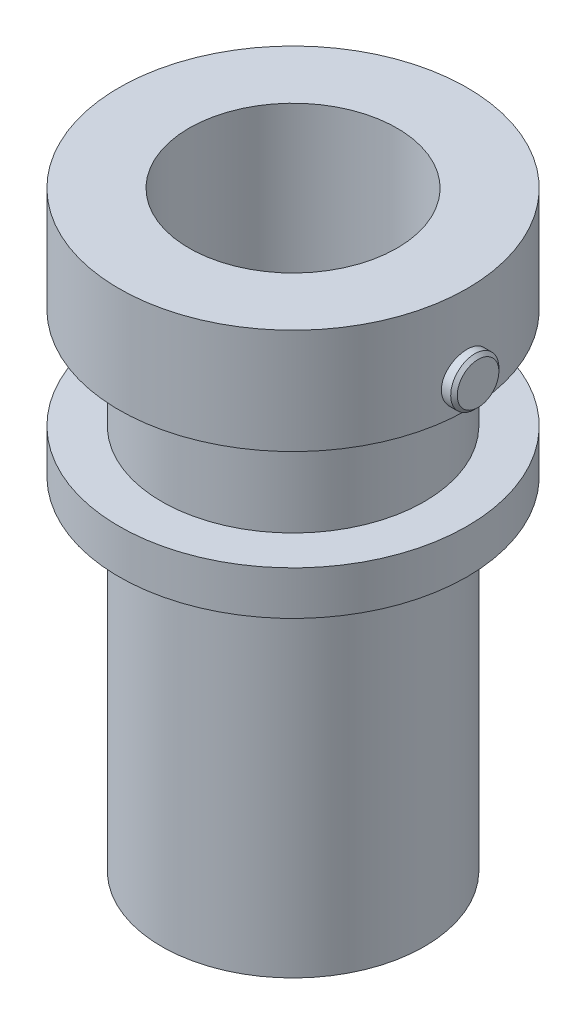
ISO-10303-21;
HEADER;
FILE_DESCRIPTION(('STEP AP214'),'2;1');
FILE_NAME('part.step','',(''),(''),'','','');
FILE_SCHEMA(('AUTOMOTIVE_DESIGN { 1 0 10303 214 1 1 1 1 }'));
ENDSEC;
DATA;
#1=APPLICATION_CONTEXT('core data for automotive mechanical design processes');
#2=APPLICATION_PROTOCOL_DEFINITION('international standard','automotive_design',2000,#1);
#3=PRODUCT_CONTEXT('',#1,'mechanical');
#4=PRODUCT('Part','Part','',(#3));
#5=PRODUCT_RELATED_PRODUCT_CATEGORY('part','',(#4));
#6=PRODUCT_DEFINITION_FORMATION('','',#4);
#7=PRODUCT_DEFINITION_CONTEXT('part definition',#1,'design');
#8=PRODUCT_DEFINITION('design','',#6,#7);
#9=PRODUCT_DEFINITION_SHAPE('','',#8);
#10=(LENGTH_UNIT() NAMED_UNIT(*) SI_UNIT(.MILLI.,.METRE.));
#11=(NAMED_UNIT(*) PLANE_ANGLE_UNIT() SI_UNIT($,.RADIAN.));
#12=(NAMED_UNIT(*) SI_UNIT($,.STERADIAN.) SOLID_ANGLE_UNIT());
#13=UNCERTAINTY_MEASURE_WITH_UNIT(LENGTH_MEASURE(1.E-05),#10,'distance_accuracy_value','');
#14=(GEOMETRIC_REPRESENTATION_CONTEXT(3) GLOBAL_UNCERTAINTY_ASSIGNED_CONTEXT((#13)) GLOBAL_UNIT_ASSIGNED_CONTEXT((#10,
#11,#12)) REPRESENTATION_CONTEXT('',''));
#15=CARTESIAN_POINT('',(0.,0.,0.));
#16=DIRECTION('',(0.,0.,1.));
#17=DIRECTION('',(1.,0.,0.));
#18=AXIS2_PLACEMENT_3D('',#15,#16,#17);
#19=CARTESIAN_POINT('',(0.,-28.35,0.));
#20=DIRECTION('',(0.,1.,0.));
#21=DIRECTION('',(1.,0.,0.));
#22=AXIS2_PLACEMENT_3D('',#19,#20,#21);
#23=CYLINDRICAL_SURFACE('',#22,4.75);
#24=CARTESIAN_POINT('',(0.,-14.5,0.));
#25=DIRECTION('',(0.,1.,0.));
#26=DIRECTION('',(1.,0.,0.));
#27=AXIS2_PLACEMENT_3D('',#24,#25,#26);
#28=CIRCLE('',#27,4.75);
#29=CARTESIAN_POINT('',(4.75,-14.5,0.));
#30=VERTEX_POINT('',#29);
#31=EDGE_CURVE('E35',#30,#30,#28,.T.);
#32=ORIENTED_EDGE('',*,*,#31,.F.);
#33=EDGE_LOOP('',(#32));
#34=FACE_BOUND('',#33,.T.);
#35=CARTESIAN_POINT('',(0.,0.,0.));
#36=DIRECTION('',(0.,1.,0.));
#37=DIRECTION('',(1.,0.,0.));
#38=AXIS2_PLACEMENT_3D('',#35,#36,#37);
#39=CIRCLE('',#38,4.75);
#40=CARTESIAN_POINT('',(4.75,0.,0.));
#41=VERTEX_POINT('',#40);
#42=EDGE_CURVE('E10',#41,#41,#39,.T.);
#43=ORIENTED_EDGE('',*,*,#42,.T.);
#44=EDGE_LOOP('',(#43));
#45=FACE_BOUND('',#44,.T.);
#46=ADVANCED_FACE('F15',(#34,#45),#23,.F.);
#47=CARTESIAN_POINT('',(0.,0.,0.));
#48=DIRECTION('',(0.,1.,0.));
#49=DIRECTION('',(1.,0.,0.));
#50=AXIS2_PLACEMENT_3D('',#47,#48,#49);
#51=PLANE('',#50);
#52=CARTESIAN_POINT('',(0.,0.,0.));
#53=DIRECTION('',(0.,-1.,0.));
#54=DIRECTION('',(1.,0.,0.));
#55=AXIS2_PLACEMENT_3D('',#52,#53,#54);
#56=CIRCLE('',#55,7.95);
#57=CARTESIAN_POINT('',(7.95,0.,0.));
#58=VERTEX_POINT('',#57);
#59=EDGE_CURVE('E40',#58,#58,#56,.T.);
#60=ORIENTED_EDGE('',*,*,#59,.F.);
#61=EDGE_LOOP('',(#60));
#62=FACE_BOUND('',#61,.T.);
#63=ORIENTED_EDGE('',*,*,#42,.F.);
#64=EDGE_LOOP('',(#63));
#65=FACE_BOUND('',#64,.T.);
#66=ADVANCED_FACE('F153',(#62,#65),#51,.T.);
#67=CARTESIAN_POINT('',(0.,-28.35,0.));
#68=DIRECTION('',(0.,1.,0.));
#69=DIRECTION('',(1.,0.,0.));
#70=AXIS2_PLACEMENT_3D('',#67,#68,#69);
#71=CYLINDRICAL_SURFACE('',#70,7.95);
#72=ORIENTED_EDGE('',*,*,#59,.T.);
#73=EDGE_LOOP('',(#72));
#74=FACE_BOUND('',#73,.T.);
#75=CARTESIAN_POINT('',(7.95,-4.6,0.));
#76=CARTESIAN_POINT('',(7.94999904250905,-4.59999725817584,-0.0614151600537309));
#77=CARTESIAN_POINT('',(7.94928027401464,-4.59483508264812,-0.12291016262668));
#78=CARTESIAN_POINT('',(7.94648045014473,-4.57431428580731,-0.24422885644809));
#79=CARTESIAN_POINT('',(7.94439658195358,-4.55893461019969,-0.304048830303224));
#80=CARTESIAN_POINT('',(7.93910096661117,-4.51844219252123,-0.420178778865689));
#81=CARTESIAN_POINT('',(7.93589048356949,-4.49334035586676,-0.4764926045802));
#82=CARTESIAN_POINT('',(7.9286983475142,-4.43413954868757,-0.584083284756709));
#83=CARTESIAN_POINT('',(7.92471700556632,-4.40004420532053,-0.635362158442217));
#84=CARTESIAN_POINT('',(7.91639594017454,-4.32357389716322,-0.731803073256726));
#85=CARTESIAN_POINT('',(7.91205418572243,-4.28114987233136,-0.77692604530919));
#86=CARTESIAN_POINT('',(7.90351761024574,-4.1893300589061,-0.859438453178167));
#87=CARTESIAN_POINT('',(7.89932280462818,-4.13993354198838,-0.896827080082414));
#88=CARTESIAN_POINT('',(7.89153592555042,-4.03531938629598,-0.962952642575501));
#89=CARTESIAN_POINT('',(7.88794641904431,-3.98007849687271,-0.991653122911559));
#90=CARTESIAN_POINT('',(7.88180336635686,-3.86550313135382,-1.03935443740351));
#91=CARTESIAN_POINT('',(7.87924976312973,-3.80616888088469,-1.05835580569132));
#92=CARTESIAN_POINT('',(7.87548700213528,-3.68549230143354,-1.0860017762823));
#93=CARTESIAN_POINT('',(7.87426936259164,-3.62416521635396,-1.09471174420416));
#94=CARTESIAN_POINT('',(7.87329055849568,-3.50090859689544,-1.10173004680069));
#95=CARTESIAN_POINT('',(7.87352932508275,-3.43897909113789,-1.10003887325364));
#96=CARTESIAN_POINT('',(7.87542859162077,-3.31673496673814,-1.08635646189809));
#97=CARTESIAN_POINT('',(7.87707908371818,-3.25641205538938,-1.07443772630599));
#98=CARTESIAN_POINT('',(7.88160023579942,-3.13863018522007,-1.04075165277379));
#99=CARTESIAN_POINT('',(7.88447093608674,-3.08117132106906,-1.01898398952206));
#100=CARTESIAN_POINT('',(7.89112036077982,-2.97052449434331,-0.966140494789752));
#101=CARTESIAN_POINT('',(7.89490214013809,-2.91735172154849,-0.935033258348422));
#102=CARTESIAN_POINT('',(7.90294494789878,-2.81695771146289,-0.864418710621034));
#103=CARTESIAN_POINT('',(7.90720596486531,-2.76973633221284,-0.824911599758555));
#104=CARTESIAN_POINT('',(7.91577094723066,-2.68216852865957,-0.738226814267531));
#105=CARTESIAN_POINT('',(7.92007497542518,-2.64188245670555,-0.690988161587765));
#106=CARTESIAN_POINT('',(7.92821013621462,-2.56978284754061,-0.590362304030005));
#107=CARTESIAN_POINT('',(7.93204105340353,-2.53797316202804,-0.536972319696201));
#108=CARTESIAN_POINT('',(7.93880186737786,-2.48373084785563,-0.425495855406076));
#109=CARTESIAN_POINT('',(7.94173061441611,-2.4613101718077,-0.367403500656875));
#110=CARTESIAN_POINT('',(7.94634356282211,-2.42660530400915,-0.248306664996592));
#111=CARTESIAN_POINT('',(7.94803039483012,-2.4142996799451,-0.187308632640684));
#112=CARTESIAN_POINT('',(7.94933556924733,-2.40481112077406,-0.104904709158067));
#113=CARTESIAN_POINT('',(7.9495842180295,-2.40300834001324,-0.0839677377703585));
#114=CARTESIAN_POINT('',(7.94991659727507,-2.40060231019831,-0.0420236275524594));
#115=CARTESIAN_POINT('',(7.95000032765685,-2.39999906173791,-0.021016488687545));
#116=CARTESIAN_POINT('',(7.94999904250905,-2.40000274182416,0.0614151600537309));
#117=CARTESIAN_POINT('',(7.94928027401464,-2.40516491735188,0.12291016262668));
#118=CARTESIAN_POINT('',(7.94648045014473,-2.42568571419269,0.24422885644809));
#119=CARTESIAN_POINT('',(7.94439658195358,-2.44106538980031,0.304048830303224));
#120=CARTESIAN_POINT('',(7.93910096661117,-2.48155780747878,0.420178778865689));
#121=CARTESIAN_POINT('',(7.93589048356949,-2.50665964413324,0.4764926045802));
#122=CARTESIAN_POINT('',(7.9286983475142,-2.56586045131243,0.58408328475671));
#123=CARTESIAN_POINT('',(7.92471700556632,-2.59995579467947,0.635362158442218));
#124=CARTESIAN_POINT('',(7.91639594017454,-2.67642610283679,0.731803073256726));
#125=CARTESIAN_POINT('',(7.91205418572243,-2.71885012766864,0.77692604530919));
#126=CARTESIAN_POINT('',(7.90351761024574,-2.8106699410939,0.859438453178167));
#127=CARTESIAN_POINT('',(7.89932280462818,-2.86006645801162,0.896827080082414));
#128=CARTESIAN_POINT('',(7.89153592555042,-2.96468061370402,0.962952642575501));
#129=CARTESIAN_POINT('',(7.88794641904431,-3.01992150312729,0.991653122911559));
#130=CARTESIAN_POINT('',(7.88180336635686,-3.13449686864618,1.03935443740351));
#131=CARTESIAN_POINT('',(7.87924976312973,-3.19383111911531,1.05835580569132));
#132=CARTESIAN_POINT('',(7.87548700213528,-3.31450769856646,1.0860017762823));
#133=CARTESIAN_POINT('',(7.87426936259164,-3.37583478364604,1.09471174420416));
#134=CARTESIAN_POINT('',(7.87329055849568,-3.49909140310456,1.10173004680069));
#135=CARTESIAN_POINT('',(7.87352932508275,-3.56102090886211,1.10003887325364));
#136=CARTESIAN_POINT('',(7.87542859162077,-3.68326503326186,1.08635646189809));
#137=CARTESIAN_POINT('',(7.87707908371818,-3.74358794461063,1.07443772630599));
#138=CARTESIAN_POINT('',(7.88160023579942,-3.86136981477993,1.04075165277379));
#139=CARTESIAN_POINT('',(7.88447093608674,-3.91882867893094,1.01898398952206));
#140=CARTESIAN_POINT('',(7.89112036077982,-4.02947550565669,0.966140494789751));
#141=CARTESIAN_POINT('',(7.89490214013809,-4.08264827845151,0.935033258348421));
#142=CARTESIAN_POINT('',(7.90294494789878,-4.18304228853711,0.864418710621034));
#143=CARTESIAN_POINT('',(7.90720596486531,-4.23026366778716,0.824911599758555));
#144=CARTESIAN_POINT('',(7.91577094723066,-4.31783147134043,0.73822681426753));
#145=CARTESIAN_POINT('',(7.92007497542518,-4.35811754329445,0.690988161587764));
#146=CARTESIAN_POINT('',(7.92821013621462,-4.43021715245939,0.590362304030005));
#147=CARTESIAN_POINT('',(7.93204105340353,-4.46202683797196,0.536972319696201));
#148=CARTESIAN_POINT('',(7.93880186737786,-4.51626915214437,0.425495855406076));
#149=CARTESIAN_POINT('',(7.94173061441611,-4.5386898281923,0.367403500656874));
#150=CARTESIAN_POINT('',(7.94634356282211,-4.57339469599085,0.248306664996591));
#151=CARTESIAN_POINT('',(7.94803039483012,-4.5857003200549,0.187308632640683));
#152=CARTESIAN_POINT('',(7.94933556924733,-4.59518887922594,0.104904709158067));
#153=CARTESIAN_POINT('',(7.9495842180295,-4.59699165998676,0.0839677377703584));
#154=CARTESIAN_POINT('',(7.94991659727507,-4.59939768980169,0.0420236275524596));
#155=CARTESIAN_POINT('',(7.95000032765685,-4.60000093826209,0.0210164886875451));
#156=CARTESIAN_POINT('',(7.95,-4.6,0.));
#157=B_SPLINE_CURVE_WITH_KNOTS('',3,(#75,#76,#77,#78,#79,#80,#81,#82,#83,#84,#85,#86,#87,#88,
#89,#90,#91,#92,#93,#94,#95,#96,#97,#98,#99,#100,#101,#102,#103,#104,#105,#106,#107,#108,#109,
#110,#111,#112,#113,#114,#115,#116,#117,#118,#119,#120,#121,#122,#123,#124,#125,#126,#127,#128,
#129,#130,#131,#132,#133,#134,#135,#136,#137,#138,#139,#140,#141,#142,#143,#144,#145,#146,#147,
#148,#149,#150,#151,#152,#153,#154,#155,#156),.UNSPECIFIED.,.T.,.F.,(4,2,2,2,2,2,2,2,2,2,2,2,2,
2,2,2,2,2,2,2,2,2,2,2,2,2,2,2,2,2,2,2,2,2,2,2,2,2,2,2,4),(0.,0.184165349969245,
0.368711375082253,0.553050990361221,0.737316373279341,0.922701628785382,1.10810626339482,
1.29427839921856,1.48044028140151,1.66541329320367,1.85037755933023,2.03404136209942,
2.21771123175581,2.40200575587851,2.58629588317076,2.77211651222792,2.95802143536655,
3.14416230923284,3.32990775372447,3.39292976775439,3.4559518129771,3.64011716294634,
3.82466318805935,4.00900280333832,4.19326818625644,4.37865344176248,4.56405807637191,
4.75023021219566,4.9363920943786,5.12136510618077,5.30632937230733,5.48999317507652,
5.67366304473291,5.85795756885561,6.04224769614785,6.22806832520502,6.41397324834365,
6.60011412220994,6.78585956670157,6.84888158073148,6.91190362595419),.UNSPECIFIED.);
#158=CARTESIAN_POINT('',(7.95,-4.6,0.));
#159=VERTEX_POINT('',#158);
#160=EDGE_CURVE('E19',#159,#159,#157,.T.);
#161=ORIENTED_EDGE('',*,*,#160,.F.);
#162=EDGE_LOOP('',(#161));
#163=FACE_BOUND('',#162,.T.);
#164=CARTESIAN_POINT('',(-7.95,-2.4,0.));
#165=CARTESIAN_POINT('',(-7.94999904250905,-2.40000274182416,-0.0614151600537309));
#166=CARTESIAN_POINT('',(-7.94928027401464,-2.40516491735188,-0.12291016262668));
#167=CARTESIAN_POINT('',(-7.94648045014473,-2.42568571419269,-0.24422885644809));
#168=CARTESIAN_POINT('',(-7.94439658195358,-2.44106538980031,-0.304048830303224));
#169=CARTESIAN_POINT('',(-7.93910096661117,-2.48155780747878,-0.420178778865689));
#170=CARTESIAN_POINT('',(-7.93589048356949,-2.50665964413324,-0.4764926045802));
#171=CARTESIAN_POINT('',(-7.9286983475142,-2.56586045131243,-0.584083284756709));
#172=CARTESIAN_POINT('',(-7.92471700556632,-2.59995579467947,-0.635362158442218));
#173=CARTESIAN_POINT('',(-7.91639594017454,-2.67642610283679,-0.731803073256726));
#174=CARTESIAN_POINT('',(-7.91205418572243,-2.71885012766864,-0.77692604530919));
#175=CARTESIAN_POINT('',(-7.90351761024574,-2.8106699410939,-0.859438453178167));
#176=CARTESIAN_POINT('',(-7.89932280462818,-2.86006645801162,-0.896827080082414));
#177=CARTESIAN_POINT('',(-7.89153592555042,-2.96468061370402,-0.962952642575501));
#178=CARTESIAN_POINT('',(-7.88794641904431,-3.01992150312729,-0.991653122911559));
#179=CARTESIAN_POINT('',(-7.88180336635686,-3.13449686864618,-1.03935443740351));
#180=CARTESIAN_POINT('',(-7.87924976312973,-3.19383111911531,-1.05835580569132));
#181=CARTESIAN_POINT('',(-7.87548700213528,-3.31450769856646,-1.0860017762823));
#182=CARTESIAN_POINT('',(-7.87426936259164,-3.37583478364604,-1.09471174420416));
#183=CARTESIAN_POINT('',(-7.87329055849568,-3.49909140310456,-1.10173004680069));
#184=CARTESIAN_POINT('',(-7.87352932508275,-3.56102090886211,-1.10003887325364));
#185=CARTESIAN_POINT('',(-7.87542859162077,-3.68326503326186,-1.08635646189809));
#186=CARTESIAN_POINT('',(-7.87707908371818,-3.74358794461062,-1.07443772630599));
#187=CARTESIAN_POINT('',(-7.88160023579942,-3.86136981477993,-1.04075165277379));
#188=CARTESIAN_POINT('',(-7.88447093608674,-3.91882867893094,-1.01898398952206));
#189=CARTESIAN_POINT('',(-7.89112036077982,-4.02947550565669,-0.966140494789751));
#190=CARTESIAN_POINT('',(-7.89490214013809,-4.08264827845151,-0.935033258348421));
#191=CARTESIAN_POINT('',(-7.90294494789878,-4.18304228853711,-0.864418710621033));
#192=CARTESIAN_POINT('',(-7.90720596486531,-4.23026366778716,-0.824911599758555));
#193=CARTESIAN_POINT('',(-7.91577094723066,-4.31783147134043,-0.738226814267531));
#194=CARTESIAN_POINT('',(-7.92007497542518,-4.35811754329445,-0.690988161587764));
#195=CARTESIAN_POINT('',(-7.92821013621462,-4.43021715245939,-0.590362304030005));
#196=CARTESIAN_POINT('',(-7.93204105340353,-4.46202683797196,-0.536972319696201));
#197=CARTESIAN_POINT('',(-7.93880186737786,-4.51626915214437,-0.425495855406076));
#198=CARTESIAN_POINT('',(-7.94173061441611,-4.5386898281923,-0.367403500656874));
#199=CARTESIAN_POINT('',(-7.94634356282211,-4.57339469599085,-0.248306664996591));
#200=CARTESIAN_POINT('',(-7.94803039483012,-4.5857003200549,-0.187308632640683));
#201=CARTESIAN_POINT('',(-7.94933556924733,-4.59518887922594,-0.104904709158067));
#202=CARTESIAN_POINT('',(-7.9495842180295,-4.59699165998676,-0.0839677377703581));
#203=CARTESIAN_POINT('',(-7.94991659727507,-4.59939768980169,-0.0420236275524593));
#204=CARTESIAN_POINT('',(-7.95000032765685,-4.60000093826209,-0.0210164886875449));
#205=CARTESIAN_POINT('',(-7.94999904250905,-4.59999725817584,0.0614151600537306));
#206=CARTESIAN_POINT('',(-7.94928027401464,-4.59483508264812,0.122910162626679));
#207=CARTESIAN_POINT('',(-7.94648045014473,-4.57431428580731,0.24422885644809));
#208=CARTESIAN_POINT('',(-7.94439658195358,-4.55893461019969,0.304048830303224));
#209=CARTESIAN_POINT('',(-7.93910096661117,-4.51844219252123,0.420178778865689));
#210=CARTESIAN_POINT('',(-7.93589048356949,-4.49334035586676,0.476492604580199));
#211=CARTESIAN_POINT('',(-7.9286983475142,-4.43413954868757,0.584083284756709));
#212=CARTESIAN_POINT('',(-7.92471700556632,-4.40004420532053,0.635362158442217));
#213=CARTESIAN_POINT('',(-7.91639594017454,-4.32357389716322,0.731803073256726));
#214=CARTESIAN_POINT('',(-7.91205418572243,-4.28114987233136,0.77692604530919));
#215=CARTESIAN_POINT('',(-7.90351761024574,-4.1893300589061,0.859438453178168));
#216=CARTESIAN_POINT('',(-7.89932280462818,-4.13993354198838,0.896827080082414));
#217=CARTESIAN_POINT('',(-7.89153592555042,-4.03531938629598,0.962952642575501));
#218=CARTESIAN_POINT('',(-7.88794641904431,-3.98007849687271,0.991653122911559));
#219=CARTESIAN_POINT('',(-7.88180336635686,-3.86550313135382,1.03935443740351));
#220=CARTESIAN_POINT('',(-7.87924976312973,-3.80616888088469,1.05835580569132));
#221=CARTESIAN_POINT('',(-7.87548700213528,-3.68549230143354,1.0860017762823));
#222=CARTESIAN_POINT('',(-7.87426936259164,-3.62416521635396,1.09471174420416));
#223=CARTESIAN_POINT('',(-7.87329055849568,-3.50090859689544,1.10173004680069));
#224=CARTESIAN_POINT('',(-7.87352932508275,-3.43897909113789,1.10003887325364));
#225=CARTESIAN_POINT('',(-7.87542859162077,-3.31673496673814,1.08635646189809));
#226=CARTESIAN_POINT('',(-7.87707908371818,-3.25641205538938,1.07443772630599));
#227=CARTESIAN_POINT('',(-7.88160023579942,-3.13863018522007,1.04075165277379));
#228=CARTESIAN_POINT('',(-7.88447093608674,-3.08117132106906,1.01898398952206));
#229=CARTESIAN_POINT('',(-7.89112036077982,-2.97052449434331,0.966140494789752));
#230=CARTESIAN_POINT('',(-7.89490214013809,-2.91735172154849,0.935033258348422));
#231=CARTESIAN_POINT('',(-7.90294494789878,-2.81695771146289,0.864418710621034));
#232=CARTESIAN_POINT('',(-7.90720596486531,-2.76973633221284,0.824911599758555));
#233=CARTESIAN_POINT('',(-7.91577094723066,-2.68216852865957,0.738226814267531));
#234=CARTESIAN_POINT('',(-7.92007497542518,-2.64188245670555,0.690988161587765));
#235=CARTESIAN_POINT('',(-7.92821013621462,-2.56978284754061,0.590362304030006));
#236=CARTESIAN_POINT('',(-7.93204105340353,-2.53797316202804,0.536972319696201));
#237=CARTESIAN_POINT('',(-7.93880186737786,-2.48373084785563,0.425495855406076));
#238=CARTESIAN_POINT('',(-7.94173061441611,-2.4613101718077,0.367403500656875));
#239=CARTESIAN_POINT('',(-7.94634356282211,-2.42660530400915,0.248306664996592));
#240=CARTESIAN_POINT('',(-7.94803039483012,-2.4142996799451,0.187308632640683));
#241=CARTESIAN_POINT('',(-7.94933556924733,-2.40481112077406,0.104904709158067));
#242=CARTESIAN_POINT('',(-7.9495842180295,-2.40300834001324,0.0839677377703586));
#243=CARTESIAN_POINT('',(-7.94991659727507,-2.40060231019831,0.0420236275524595));
#244=CARTESIAN_POINT('',(-7.95000032765685,-2.39999906173791,0.021016488687545));
#245=CARTESIAN_POINT('',(-7.95,-2.4,0.));
#246=B_SPLINE_CURVE_WITH_KNOTS('',3,(#164,#165,#166,#167,#168,#169,#170,#171,#172,#173,#174,
#175,#176,#177,#178,#179,#180,#181,#182,#183,#184,#185,#186,#187,#188,#189,#190,#191,#192,#193,
#194,#195,#196,#197,#198,#199,#200,#201,#202,#203,#204,#205,#206,#207,#208,#209,#210,#211,#212,
#213,#214,#215,#216,#217,#218,#219,#220,#221,#222,#223,#224,#225,#226,#227,#228,#229,#230,#231,
#232,#233,#234,#235,#236,#237,#238,#239,#240,#241,#242,#243,#244,#245),.UNSPECIFIED.,.T.,.F.,(4,
2,2,2,2,2,2,2,2,2,2,2,2,2,2,2,2,2,2,2,2,2,2,2,2,2,2,2,2,2,2,2,2,2,2,2,2,2,2,2,4),(0.,
0.184165349969245,0.368711375082253,0.553050990361221,0.737316373279341,0.922701628785382,
1.10810626339482,1.29427839921856,1.48044028140151,1.66541329320367,1.85037755933023,
2.03404136209942,2.21771123175581,2.40200575587851,2.58629588317076,2.77211651222792,
2.95802143536655,3.14416230923284,3.32990775372447,3.39292976775439,3.4559518129771,
3.64011716294634,3.82466318805935,4.00900280333832,4.19326818625644,4.37865344176248,
4.56405807637191,4.75023021219566,4.93639209437861,5.12136510618077,5.30632937230733,
5.48999317507652,5.67366304473291,5.85795756885561,6.04224769614785,6.22806832520502,
6.41397324834365,6.60011412220994,6.78585956670157,6.84888158073148,6.9119036259542),.UNSPECIFIED.);
#247=CARTESIAN_POINT('',(-7.95,-2.4,0.));
#248=VERTEX_POINT('',#247);
#249=EDGE_CURVE('E32',#248,#248,#246,.T.);
#250=ORIENTED_EDGE('',*,*,#249,.F.);
#251=EDGE_LOOP('',(#250));
#252=FACE_BOUND('',#251,.T.);
#253=CARTESIAN_POINT('',(0.,-4.8,0.));
#254=DIRECTION('',(0.,1.,0.));
#255=DIRECTION('',(1.,0.,0.));
#256=AXIS2_PLACEMENT_3D('',#253,#254,#255);
#257=CIRCLE('',#256,7.95);
#258=CARTESIAN_POINT('',(7.95,-4.8,0.));
#259=VERTEX_POINT('',#258);
#260=EDGE_CURVE('E27',#259,#259,#257,.T.);
#261=ORIENTED_EDGE('',*,*,#260,.T.);
#262=EDGE_LOOP('',(#261));
#263=FACE_BOUND('',#262,.T.);
#264=ADVANCED_FACE('F83',(#74,#163,#252,#263),#71,.T.);
#265=CARTESIAN_POINT('',(-7.45,-3.5,0.));
#266=DIRECTION('',(-1.,0.,0.));
#267=DIRECTION('',(0.,-1.,0.));
#268=AXIS2_PLACEMENT_3D('',#265,#266,#267);
#269=CYLINDRICAL_SURFACE('',#268,1.1);
#270=CARTESIAN_POINT('',(-8.3,-3.5,0.));
#271=DIRECTION('',(-1.,0.,0.));
#272=DIRECTION('',(0.,1.,0.));
#273=AXIS2_PLACEMENT_3D('',#270,#271,#272);
#274=CIRCLE('',#273,1.1);
#275=CARTESIAN_POINT('',(-8.3,-2.4,0.));
#276=VERTEX_POINT('',#275);
#277=EDGE_CURVE('E45',#276,#276,#274,.T.);
#278=ORIENTED_EDGE('',*,*,#277,.F.);
#279=EDGE_LOOP('',(#278));
#280=FACE_BOUND('',#279,.T.);
#281=ORIENTED_EDGE('',*,*,#249,.T.);
#282=EDGE_LOOP('',(#281));
#283=FACE_BOUND('',#282,.T.);
#284=ADVANCED_FACE('F86',(#280,#283),#269,.T.);
#285=CARTESIAN_POINT('',(-8.375000002509,-3.5,0.));
#286=DIRECTION('',(1.,0.,0.));
#287=DIRECTION('',(0.,0.,-1.));
#288=AXIS2_PLACEMENT_3D('',#285,#286,#287);
#289=CONICAL_SURFACE('',#288,1.024999997491,0.7853981633973);
#290=ORIENTED_EDGE('',*,*,#277,.T.);
#291=EDGE_LOOP('',(#290));
#292=FACE_BOUND('',#291,.T.);
#293=CARTESIAN_POINT('',(-8.45,-3.5,0.));
#294=DIRECTION('',(-1.,0.,0.));
#295=DIRECTION('',(0.,1.,0.));
#296=AXIS2_PLACEMENT_3D('',#293,#294,#295);
#297=CIRCLE('',#296,0.95);
#298=CARTESIAN_POINT('',(-8.45,-2.55,0.));
#299=VERTEX_POINT('',#298);
#300=EDGE_CURVE('E42',#299,#299,#297,.T.);
#301=ORIENTED_EDGE('',*,*,#300,.F.);
#302=EDGE_LOOP('',(#301));
#303=FACE_BOUND('',#302,.T.);
#304=ADVANCED_FACE('F90',(#292,#303),#289,.T.);
#305=CARTESIAN_POINT('',(-8.45,0.,0.));
#306=DIRECTION('',(-1.,0.,0.));
#307=DIRECTION('',(0.,-1.,0.));
#308=AXIS2_PLACEMENT_3D('',#305,#306,#307);
#309=PLANE('',#308);
#310=ORIENTED_EDGE('',*,*,#300,.T.);
#311=EDGE_LOOP('',(#310));
#312=FACE_BOUND('',#311,.T.);
#313=ADVANCED_FACE('F94',(#312),#309,.T.);
#314=CARTESIAN_POINT('',(7.45,-3.5,0.));
#315=DIRECTION('',(1.,0.,0.));
#316=DIRECTION('',(0.,1.,0.));
#317=AXIS2_PLACEMENT_3D('',#314,#315,#316);
#318=CYLINDRICAL_SURFACE('',#317,1.1);
#319=CARTESIAN_POINT('',(8.3,-3.5,0.));
#320=DIRECTION('',(1.,0.,0.));
#321=DIRECTION('',(0.,1.,0.));
#322=AXIS2_PLACEMENT_3D('',#319,#320,#321);
#323=CIRCLE('',#322,1.1);
#324=CARTESIAN_POINT('',(8.3,-2.4,0.));
#325=VERTEX_POINT('',#324);
#326=EDGE_CURVE('E43',#325,#325,#323,.T.);
#327=ORIENTED_EDGE('',*,*,#326,.F.);
#328=EDGE_LOOP('',(#327));
#329=FACE_BOUND('',#328,.T.);
#330=ORIENTED_EDGE('',*,*,#160,.T.);
#331=EDGE_LOOP('',(#330));
#332=FACE_BOUND('',#331,.T.);
#333=ADVANCED_FACE('F97',(#329,#332),#318,.T.);
#334=CARTESIAN_POINT('',(8.375000002509,-3.5,0.));
#335=DIRECTION('',(-1.,0.,0.));
#336=DIRECTION('',(0.,0.,-1.));
#337=AXIS2_PLACEMENT_3D('',#334,#335,#336);
#338=CONICAL_SURFACE('',#337,1.024999997491,0.7853981633973);
#339=ORIENTED_EDGE('',*,*,#326,.T.);
#340=EDGE_LOOP('',(#339));
#341=FACE_BOUND('',#340,.T.);
#342=CARTESIAN_POINT('',(8.45,-3.5,0.));
#343=DIRECTION('',(1.,0.,0.));
#344=DIRECTION('',(0.,1.,0.));
#345=AXIS2_PLACEMENT_3D('',#342,#343,#344);
#346=CIRCLE('',#345,0.95);
#347=CARTESIAN_POINT('',(8.45,-2.55,0.));
#348=VERTEX_POINT('',#347);
#349=EDGE_CURVE('E52',#348,#348,#346,.T.);
#350=ORIENTED_EDGE('',*,*,#349,.F.);
#351=EDGE_LOOP('',(#350));
#352=FACE_BOUND('',#351,.T.);
#353=ADVANCED_FACE('F102',(#341,#352),#338,.T.);
#354=CARTESIAN_POINT('',(8.45,0.,0.));
#355=DIRECTION('',(1.,0.,0.));
#356=DIRECTION('',(0.,1.,0.));
#357=AXIS2_PLACEMENT_3D('',#354,#355,#356);
#358=PLANE('',#357);
#359=ORIENTED_EDGE('',*,*,#349,.T.);
#360=EDGE_LOOP('',(#359));
#361=FACE_BOUND('',#360,.T.);
#362=ADVANCED_FACE('F106',(#361),#358,.T.);
#363=CARTESIAN_POINT('',(0.,-4.8,0.));
#364=DIRECTION('',(0.,1.,0.));
#365=DIRECTION('',(1.,0.,0.));
#366=AXIS2_PLACEMENT_3D('',#363,#364,#365);
#367=PLANE('',#366);
#368=ORIENTED_EDGE('',*,*,#260,.F.);
#369=EDGE_LOOP('',(#368));
#370=FACE_BOUND('',#369,.T.);
#371=CARTESIAN_POINT('',(0.,-4.8,0.));
#372=DIRECTION('',(0.,-1.,0.));
#373=DIRECTION('',(1.,0.,0.));
#374=AXIS2_PLACEMENT_3D('',#371,#372,#373);
#375=CIRCLE('',#374,6.);
#376=CARTESIAN_POINT('',(6.,-4.8,0.));
#377=VERTEX_POINT('',#376);
#378=EDGE_CURVE('E55',#377,#377,#375,.T.);
#379=ORIENTED_EDGE('',*,*,#378,.F.);
#380=EDGE_LOOP('',(#379));
#381=FACE_BOUND('',#380,.T.);
#382=ADVANCED_FACE('F110',(#370,#381),#367,.F.);
#383=CARTESIAN_POINT('',(0.,-28.35,0.));
#384=DIRECTION('',(0.,1.,0.));
#385=DIRECTION('',(1.,0.,0.));
#386=AXIS2_PLACEMENT_3D('',#383,#384,#385);
#387=CYLINDRICAL_SURFACE('',#386,6.);
#388=ORIENTED_EDGE('',*,*,#378,.T.);
#389=EDGE_LOOP('',(#388));
#390=FACE_BOUND('',#389,.T.);
#391=CARTESIAN_POINT('',(0.,-9.4,0.));
#392=DIRECTION('',(0.,1.,0.));
#393=DIRECTION('',(1.,0.,0.));
#394=AXIS2_PLACEMENT_3D('',#391,#392,#393);
#395=CIRCLE('',#394,6.);
#396=CARTESIAN_POINT('',(6.,-9.4,0.));
#397=VERTEX_POINT('',#396);
#398=EDGE_CURVE('E58',#397,#397,#395,.T.);
#399=ORIENTED_EDGE('',*,*,#398,.T.);
#400=EDGE_LOOP('',(#399));
#401=FACE_BOUND('',#400,.T.);
#402=ADVANCED_FACE('F114',(#390,#401),#387,.T.);
#403=CARTESIAN_POINT('',(0.,-9.4,0.));
#404=DIRECTION('',(0.,1.,0.));
#405=DIRECTION('',(1.,0.,0.));
#406=AXIS2_PLACEMENT_3D('',#403,#404,#405);
#407=PLANE('',#406);
#408=CARTESIAN_POINT('',(0.,-9.4,0.));
#409=DIRECTION('',(0.,-1.,0.));
#410=DIRECTION('',(1.,0.,0.));
#411=AXIS2_PLACEMENT_3D('',#408,#409,#410);
#412=CIRCLE('',#411,7.95);
#413=CARTESIAN_POINT('',(7.95,-9.4,0.));
#414=VERTEX_POINT('',#413);
#415=EDGE_CURVE('E62',#414,#414,#412,.T.);
#416=ORIENTED_EDGE('',*,*,#415,.F.);
#417=EDGE_LOOP('',(#416));
#418=FACE_BOUND('',#417,.T.);
#419=ORIENTED_EDGE('',*,*,#398,.F.);
#420=EDGE_LOOP('',(#419));
#421=FACE_BOUND('',#420,.T.);
#422=ADVANCED_FACE('F118',(#418,#421),#407,.T.);
#423=CARTESIAN_POINT('',(0.,-28.35,0.));
#424=DIRECTION('',(0.,1.,0.));
#425=DIRECTION('',(1.,0.,0.));
#426=AXIS2_PLACEMENT_3D('',#423,#424,#425);
#427=CYLINDRICAL_SURFACE('',#426,7.95);
#428=ORIENTED_EDGE('',*,*,#415,.T.);
#429=EDGE_LOOP('',(#428));
#430=FACE_BOUND('',#429,.T.);
#431=CARTESIAN_POINT('',(0.,-11.4,0.));
#432=DIRECTION('',(0.,1.,0.));
#433=DIRECTION('',(1.,0.,0.));
#434=AXIS2_PLACEMENT_3D('',#431,#432,#433);
#435=CIRCLE('',#434,7.95);
#436=CARTESIAN_POINT('',(7.95,-11.4,0.));
#437=VERTEX_POINT('',#436);
#438=EDGE_CURVE('E59',#437,#437,#435,.T.);
#439=ORIENTED_EDGE('',*,*,#438,.T.);
#440=EDGE_LOOP('',(#439));
#441=FACE_BOUND('',#440,.T.);
#442=ADVANCED_FACE('F122',(#430,#441),#427,.T.);
#443=CARTESIAN_POINT('',(0.,-11.4,0.));
#444=DIRECTION('',(0.,1.,0.));
#445=DIRECTION('',(1.,0.,0.));
#446=AXIS2_PLACEMENT_3D('',#443,#444,#445);
#447=PLANE('',#446);
#448=ORIENTED_EDGE('',*,*,#438,.F.);
#449=EDGE_LOOP('',(#448));
#450=FACE_BOUND('',#449,.T.);
#451=CARTESIAN_POINT('',(0.,-11.4,0.));
#452=DIRECTION('',(0.,-1.,0.));
#453=DIRECTION('',(1.,0.,0.));
#454=AXIS2_PLACEMENT_3D('',#451,#452,#453);
#455=CIRCLE('',#454,6.);
#456=CARTESIAN_POINT('',(6.,-11.4,0.));
#457=VERTEX_POINT('',#456);
#458=EDGE_CURVE('E68',#457,#457,#455,.T.);
#459=ORIENTED_EDGE('',*,*,#458,.F.);
#460=EDGE_LOOP('',(#459));
#461=FACE_BOUND('',#460,.T.);
#462=ADVANCED_FACE('F126',(#450,#461),#447,.F.);
#463=CARTESIAN_POINT('',(0.,-28.35,0.));
#464=DIRECTION('',(0.,1.,0.));
#465=DIRECTION('',(1.,0.,0.));
#466=AXIS2_PLACEMENT_3D('',#463,#464,#465);
#467=CYLINDRICAL_SURFACE('',#466,6.);
#468=ORIENTED_EDGE('',*,*,#458,.T.);
#469=EDGE_LOOP('',(#468));
#470=FACE_BOUND('',#469,.T.);
#471=CARTESIAN_POINT('',(0.,-27.,0.));
#472=DIRECTION('',(0.,1.,0.));
#473=DIRECTION('',(1.,0.,0.));
#474=AXIS2_PLACEMENT_3D('',#471,#472,#473);
#475=CIRCLE('',#474,6.);
#476=CARTESIAN_POINT('',(6.,-27.,0.));
#477=VERTEX_POINT('',#476);
#478=EDGE_CURVE('E65',#477,#477,#475,.T.);
#479=ORIENTED_EDGE('',*,*,#478,.T.);
#480=EDGE_LOOP('',(#479));
#481=FACE_BOUND('',#480,.T.);
#482=ADVANCED_FACE('F130',(#470,#481),#467,.T.);
#483=CARTESIAN_POINT('',(0.,-27.,0.));
#484=DIRECTION('',(0.,1.,0.));
#485=DIRECTION('',(1.,0.,0.));
#486=AXIS2_PLACEMENT_3D('',#483,#484,#485);
#487=PLANE('',#486);
#488=ORIENTED_EDGE('',*,*,#478,.F.);
#489=EDGE_LOOP('',(#488));
#490=FACE_BOUND('',#489,.T.);
#491=CARTESIAN_POINT('',(0.,-27.,0.));
#492=DIRECTION('',(0.,1.,0.));
#493=DIRECTION('',(-1.,0.,0.));
#494=AXIS2_PLACEMENT_3D('',#491,#492,#493);
#495=CIRCLE('',#494,3.5);
#496=CARTESIAN_POINT('',(-3.5,-27.,0.));
#497=VERTEX_POINT('',#496);
#498=EDGE_CURVE('E71',#497,#497,#495,.T.);
#499=ORIENTED_EDGE('',*,*,#498,.T.);
#500=EDGE_LOOP('',(#499));
#501=FACE_BOUND('',#500,.T.);
#502=ADVANCED_FACE('F134',(#490,#501),#487,.F.);
#503=CARTESIAN_POINT('',(0.,-26.49999999949,0.));
#504=DIRECTION('',(0.,-1.,0.));
#505=DIRECTION('',(0.,0.,-1.));
#506=AXIS2_PLACEMENT_3D('',#503,#504,#505);
#507=CONICAL_SURFACE('',#506,2.999999999492,0.7853981633973);
#508=CARTESIAN_POINT('',(0.,-26.,0.));
#509=DIRECTION('',(0.,1.,0.));
#510=DIRECTION('',(1.,0.,0.));
#511=AXIS2_PLACEMENT_3D('',#508,#509,#510);
#512=CIRCLE('',#511,2.5);
#513=CARTESIAN_POINT('',(2.5,-26.,0.));
#514=VERTEX_POINT('',#513);
#515=EDGE_CURVE('E38',#514,#514,#512,.T.);
#516=ORIENTED_EDGE('',*,*,#515,.T.);
#517=EDGE_LOOP('',(#516));
#518=FACE_BOUND('',#517,.T.);
#519=ORIENTED_EDGE('',*,*,#498,.F.);
#520=EDGE_LOOP('',(#519));
#521=FACE_BOUND('',#520,.T.);
#522=ADVANCED_FACE('F138',(#518,#521),#507,.F.);
#523=CARTESIAN_POINT('',(0.,4.185,0.));
#524=DIRECTION('',(0.,-1.,0.));
#525=DIRECTION('',(-1.,0.,0.));
#526=AXIS2_PLACEMENT_3D('',#523,#524,#525);
#527=CYLINDRICAL_SURFACE('',#526,2.5);
#528=ORIENTED_EDGE('',*,*,#515,.F.);
#529=EDGE_LOOP('',(#528));
#530=FACE_BOUND('',#529,.T.);
#531=CARTESIAN_POINT('',(0.,-14.5,0.));
#532=DIRECTION('',(0.,-1.,0.));
#533=DIRECTION('',(1.,0.,0.));
#534=AXIS2_PLACEMENT_3D('',#531,#532,#533);
#535=CIRCLE('',#534,2.5);
#536=CARTESIAN_POINT('',(2.5,-14.5,0.));
#537=VERTEX_POINT('',#536);
#538=EDGE_CURVE('E39',#537,#537,#535,.T.);
#539=ORIENTED_EDGE('',*,*,#538,.F.);
#540=EDGE_LOOP('',(#539));
#541=FACE_BOUND('',#540,.T.);
#542=ADVANCED_FACE('F141',(#530,#541),#527,.F.);
#543=CARTESIAN_POINT('',(0.,-14.5,0.));
#544=DIRECTION('',(0.,1.,0.));
#545=DIRECTION('',(1.,0.,0.));
#546=AXIS2_PLACEMENT_3D('',#543,#544,#545);
#547=PLANE('',#546);
#548=ORIENTED_EDGE('',*,*,#31,.T.);
#549=EDGE_LOOP('',(#548));
#550=FACE_BOUND('',#549,.T.);
#551=ORIENTED_EDGE('',*,*,#538,.T.);
#552=EDGE_LOOP('',(#551));
#553=FACE_BOUND('',#552,.T.);
#554=ADVANCED_FACE('F17',(#550,#553),#547,.T.);
#555=CLOSED_SHELL('',(#46,#66,#264,#284,#304,#313,#333,#353,#362,#382,#402,#422,#442,#462,#482,
#502,#522,#542,#554));
#556=MANIFOLD_SOLID_BREP('B1',#555);
#557=ADVANCED_BREP_SHAPE_REPRESENTATION('',(#18,#556),#14);
#558=SHAPE_DEFINITION_REPRESENTATION(#9,#557);
ENDSEC;
END-ISO-10303-21;
